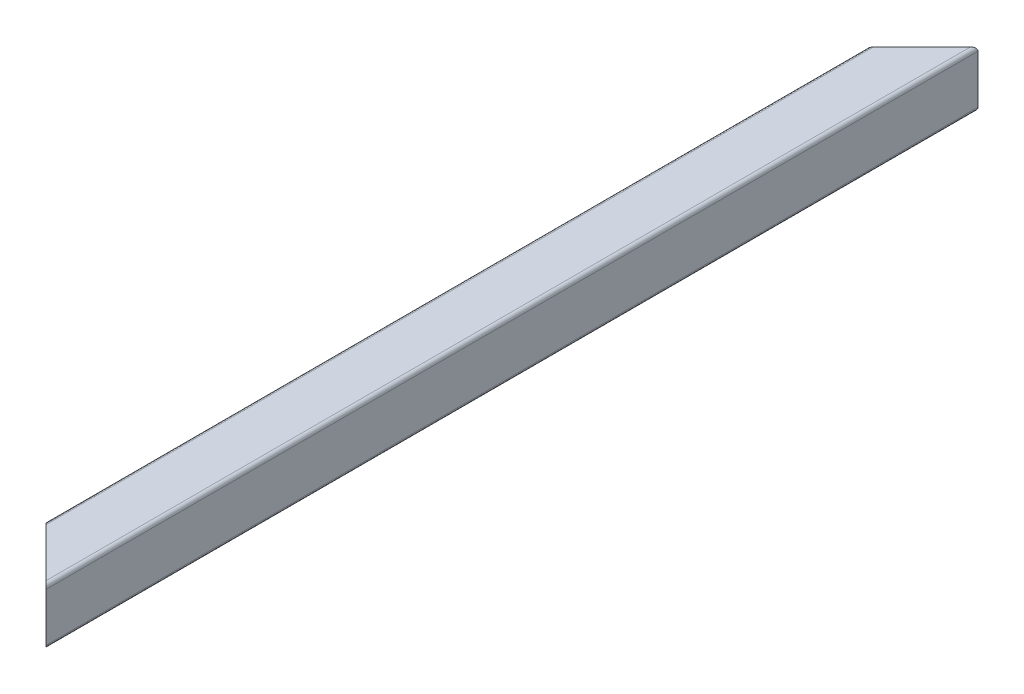
ISO-10303-21;
HEADER;
FILE_DESCRIPTION(('STEP AP214'),'2;1');
FILE_NAME('part.step','',(''),(''),'','','');
FILE_SCHEMA(('AUTOMOTIVE_DESIGN { 1 0 10303 214 1 1 1 1 }'));
ENDSEC;
DATA;
#1=APPLICATION_CONTEXT('core data for automotive mechanical design processes');
#2=APPLICATION_PROTOCOL_DEFINITION('international standard','automotive_design',2000,#1);
#3=PRODUCT_CONTEXT('',#1,'mechanical');
#4=PRODUCT('Part','Part','',(#3));
#5=PRODUCT_RELATED_PRODUCT_CATEGORY('part','',(#4));
#6=PRODUCT_DEFINITION_FORMATION('','',#4);
#7=PRODUCT_DEFINITION_CONTEXT('part definition',#1,'design');
#8=PRODUCT_DEFINITION('design','',#6,#7);
#9=PRODUCT_DEFINITION_SHAPE('','',#8);
#10=(LENGTH_UNIT() NAMED_UNIT(*) SI_UNIT(.MILLI.,.METRE.));
#11=(NAMED_UNIT(*) PLANE_ANGLE_UNIT() SI_UNIT($,.RADIAN.));
#12=(NAMED_UNIT(*) SI_UNIT($,.STERADIAN.) SOLID_ANGLE_UNIT());
#13=UNCERTAINTY_MEASURE_WITH_UNIT(LENGTH_MEASURE(1.E-05),#10,'distance_accuracy_value','');
#14=(GEOMETRIC_REPRESENTATION_CONTEXT(3) GLOBAL_UNCERTAINTY_ASSIGNED_CONTEXT((#13)) GLOBAL_UNIT_ASSIGNED_CONTEXT((#10,
#11,#12)) REPRESENTATION_CONTEXT('',''));
#15=CARTESIAN_POINT('',(0.,0.,0.));
#16=DIRECTION('',(0.,0.,1.));
#17=DIRECTION('',(1.,0.,0.));
#18=AXIS2_PLACEMENT_3D('',#15,#16,#17);
#19=CARTESIAN_POINT('',(15.,13.,-250.));
#20=DIRECTION('',(1.,0.,0.));
#21=DIRECTION('',(0.,1.,0.));
#22=AXIS2_PLACEMENT_3D('',#19,#20,#21);
#23=PLANE('',#22);
#24=DIRECTION('',(0.,0.,1.));
#25=VECTOR('',#24,1.);
#26=CARTESIAN_POINT('',(15.,13.,-250.));
#27=LINE('',#26,#25);
#28=CARTESIAN_POINT('',(15.,13.,-250.));
#29=VERTEX_POINT('',#28);
#30=CARTESIAN_POINT('',(15.,13.,250.));
#31=VERTEX_POINT('',#30);
#32=EDGE_CURVE('E157',#29,#31,#27,.T.);
#33=ORIENTED_EDGE('',*,*,#32,.T.);
#34=DIRECTION('',(0.,1.,0.));
#35=VECTOR('',#34,1.);
#36=CARTESIAN_POINT('',(15.,13.,250.));
#37=LINE('',#36,#35);
#38=CARTESIAN_POINT('',(15.,-13.,250.));
#39=VERTEX_POINT('',#38);
#40=EDGE_CURVE('E213',#39,#31,#37,.T.);
#41=ORIENTED_EDGE('',*,*,#40,.F.);
#42=DIRECTION('',(0.,0.,1.));
#43=VECTOR('',#42,1.);
#44=CARTESIAN_POINT('',(15.,-13.,-250.));
#45=LINE('',#44,#43);
#46=CARTESIAN_POINT('',(15.,-13.,-250.));
#47=VERTEX_POINT('',#46);
#48=EDGE_CURVE('E159',#47,#39,#45,.T.);
#49=ORIENTED_EDGE('',*,*,#48,.F.);
#50=DIRECTION('',(0.,1.,0.));
#51=VECTOR('',#50,1.);
#52=CARTESIAN_POINT('',(15.,13.,-250.));
#53=LINE('',#52,#51);
#54=EDGE_CURVE('E161',#47,#29,#53,.T.);
#55=ORIENTED_EDGE('',*,*,#54,.T.);
#56=EDGE_LOOP('',(#33,#41,#49,#55));
#57=FACE_BOUND('',#56,.T.);
#58=ADVANCED_FACE('F34',(#57),#23,.T.);
#59=CARTESIAN_POINT('',(13.,13.,-250.));
#60=DIRECTION('',(0.,0.,1.));
#61=DIRECTION('',(1.,0.,0.));
#62=AXIS2_PLACEMENT_3D('',#59,#60,#61);
#63=CYLINDRICAL_SURFACE('',#62,2.);
#64=ORIENTED_EDGE('',*,*,#32,.F.);
#65=CARTESIAN_POINT('',(13.,13.,-248.));
#66=DIRECTION('',(-0.707106781186544,0.,-0.707106781186551));
#67=DIRECTION('',(-0.707106781186551,0.,0.707106781186544));
#68=AXIS2_PLACEMENT_3D('',#65,#66,#67);
#69=ELLIPSE('',#68,2.82842712474618,2.);
#70=CARTESIAN_POINT('',(13.,15.,-248.));
#71=VERTEX_POINT('',#70);
#72=EDGE_CURVE('E202',#29,#71,#69,.F.);
#73=ORIENTED_EDGE('',*,*,#72,.T.);
#74=DIRECTION('',(0.,0.,1.));
#75=VECTOR('',#74,1.);
#76=CARTESIAN_POINT('',(13.,15.,-250.));
#77=LINE('',#76,#75);
#78=CARTESIAN_POINT('',(13.,15.,248.));
#79=VERTEX_POINT('',#78);
#80=EDGE_CURVE('E151',#71,#79,#77,.T.);
#81=ORIENTED_EDGE('',*,*,#80,.T.);
#82=CARTESIAN_POINT('',(13.,13.,248.));
#83=DIRECTION('',(-0.707106781186543,0.,0.707106781186552));
#84=DIRECTION('',(0.707106781186552,0.,0.707106781186543));
#85=AXIS2_PLACEMENT_3D('',#82,#83,#84);
#86=ELLIPSE('',#85,2.82842712474617,2.);
#87=EDGE_CURVE('E232',#79,#31,#86,.F.);
#88=ORIENTED_EDGE('',*,*,#87,.T.);
#89=EDGE_LOOP('',(#64,#73,#81,#88));
#90=FACE_BOUND('',#89,.T.);
#91=ADVANCED_FACE('F245',(#90),#63,.T.);
#92=CARTESIAN_POINT('',(-13.,15.,-250.));
#93=DIRECTION('',(0.,1.,0.));
#94=DIRECTION('',(0.,0.,1.));
#95=AXIS2_PLACEMENT_3D('',#92,#93,#94);
#96=PLANE('',#95);
#97=ORIENTED_EDGE('',*,*,#80,.F.);
#98=DIRECTION('',(-0.707106781186551,0.,0.707106781186544));
#99=VECTOR('',#98,1.);
#100=CARTESIAN_POINT('',(0.999999999999864,15.,-236.));
#101=LINE('',#100,#99);
#102=CARTESIAN_POINT('',(-13.,15.,-222.));
#103=VERTEX_POINT('',#102);
#104=EDGE_CURVE('E205',#71,#103,#101,.T.);
#105=ORIENTED_EDGE('',*,*,#104,.T.);
#106=DIRECTION('',(0.,0.,1.));
#107=VECTOR('',#106,1.);
#108=CARTESIAN_POINT('',(-13.,15.,-250.));
#109=LINE('',#108,#107);
#110=CARTESIAN_POINT('',(-13.,15.,222.));
#111=VERTEX_POINT('',#110);
#112=EDGE_CURVE('E147',#103,#111,#109,.T.);
#113=ORIENTED_EDGE('',*,*,#112,.T.);
#114=DIRECTION('',(0.707106781186552,0.,0.707106781186543));
#115=VECTOR('',#114,1.);
#116=CARTESIAN_POINT('',(-249.,15.,-13.9999999999969));
#117=LINE('',#116,#115);
#118=EDGE_CURVE('E127',#111,#79,#117,.T.);
#119=ORIENTED_EDGE('',*,*,#118,.T.);
#120=EDGE_LOOP('',(#97,#105,#113,#119));
#121=FACE_BOUND('',#120,.T.);
#122=ADVANCED_FACE('F242',(#121),#96,.T.);
#123=CARTESIAN_POINT('',(-13.,13.,-250.));
#124=DIRECTION('',(0.,0.,1.));
#125=DIRECTION('',(1.,0.,0.));
#126=AXIS2_PLACEMENT_3D('',#123,#124,#125);
#127=CYLINDRICAL_SURFACE('',#126,2.);
#128=ORIENTED_EDGE('',*,*,#112,.F.);
#129=CARTESIAN_POINT('',(-13.,13.,-222.));
#130=DIRECTION('',(-0.707106781186544,0.,-0.707106781186551));
#131=DIRECTION('',(-0.707106781186551,0.,0.707106781186544));
#132=AXIS2_PLACEMENT_3D('',#129,#130,#131);
#133=ELLIPSE('',#132,2.82842712474618,2.);
#134=CARTESIAN_POINT('',(-15.,13.,-220.));
#135=VERTEX_POINT('',#134);
#136=EDGE_CURVE('E146',#103,#135,#133,.F.);
#137=ORIENTED_EDGE('',*,*,#136,.T.);
#138=DIRECTION('',(0.,0.,1.));
#139=VECTOR('',#138,1.);
#140=CARTESIAN_POINT('',(-15.,13.,-250.));
#141=LINE('',#140,#139);
#142=CARTESIAN_POINT('',(-15.,13.,220.));
#143=VERTEX_POINT('',#142);
#144=EDGE_CURVE('E139',#135,#143,#141,.T.);
#145=ORIENTED_EDGE('',*,*,#144,.T.);
#146=CARTESIAN_POINT('',(-13.,13.,222.));
#147=DIRECTION('',(-0.707106781186543,0.,0.707106781186552));
#148=DIRECTION('',(0.707106781186552,0.,0.707106781186543));
#149=AXIS2_PLACEMENT_3D('',#146,#147,#148);
#150=ELLIPSE('',#149,2.82842712474617,2.);
#151=EDGE_CURVE('E121',#143,#111,#150,.F.);
#152=ORIENTED_EDGE('',*,*,#151,.T.);
#153=EDGE_LOOP('',(#128,#137,#145,#152));
#154=FACE_BOUND('',#153,.T.);
#155=ADVANCED_FACE('F145',(#154),#127,.T.);
#156=CARTESIAN_POINT('',(-15.,13.,-250.));
#157=DIRECTION('',(-1.,0.,0.));
#158=DIRECTION('',(0.,-1.,0.));
#159=AXIS2_PLACEMENT_3D('',#156,#157,#158);
#160=PLANE('',#159);
#161=ORIENTED_EDGE('',*,*,#144,.F.);
#162=DIRECTION('',(0.,-1.,0.));
#163=VECTOR('',#162,1.);
#164=CARTESIAN_POINT('',(-15.,250.,-220.));
#165=LINE('',#164,#163);
#166=CARTESIAN_POINT('',(-15.,-13.,-220.));
#167=VERTEX_POINT('',#166);
#168=EDGE_CURVE('E142',#135,#167,#165,.T.);
#169=ORIENTED_EDGE('',*,*,#168,.T.);
#170=DIRECTION('',(0.,0.,1.));
#171=VECTOR('',#170,1.);
#172=CARTESIAN_POINT('',(-15.,-13.,-250.));
#173=LINE('',#172,#171);
#174=CARTESIAN_POINT('',(-15.,-13.,220.));
#175=VERTEX_POINT('',#174);
#176=EDGE_CURVE('E141',#167,#175,#173,.T.);
#177=ORIENTED_EDGE('',*,*,#176,.T.);
#178=DIRECTION('',(0.,-1.,0.));
#179=VECTOR('',#178,1.);
#180=CARTESIAN_POINT('',(-15.,250.,220.));
#181=LINE('',#180,#179);
#182=EDGE_CURVE('E124',#143,#175,#181,.T.);
#183=ORIENTED_EDGE('',*,*,#182,.F.);
#184=EDGE_LOOP('',(#161,#169,#177,#183));
#185=FACE_BOUND('',#184,.T.);
#186=ADVANCED_FACE('F137',(#185),#160,.T.);
#187=CARTESIAN_POINT('',(-13.,-13.,-250.));
#188=DIRECTION('',(0.,0.,1.));
#189=DIRECTION('',(1.,0.,0.));
#190=AXIS2_PLACEMENT_3D('',#187,#188,#189);
#191=CYLINDRICAL_SURFACE('',#190,2.);
#192=ORIENTED_EDGE('',*,*,#176,.F.);
#193=CARTESIAN_POINT('',(-13.,-13.,-222.));
#194=DIRECTION('',(-0.707106781186544,0.,-0.707106781186551));
#195=DIRECTION('',(-0.707106781186551,0.,0.707106781186544));
#196=AXIS2_PLACEMENT_3D('',#193,#194,#195);
#197=ELLIPSE('',#196,2.82842712474618,2.);
#198=CARTESIAN_POINT('',(-13.,-15.,-222.));
#199=VERTEX_POINT('',#198);
#200=EDGE_CURVE('E184',#167,#199,#197,.F.);
#201=ORIENTED_EDGE('',*,*,#200,.T.);
#202=DIRECTION('',(0.,0.,1.));
#203=VECTOR('',#202,1.);
#204=CARTESIAN_POINT('',(-13.,-15.,-250.));
#205=LINE('',#204,#203);
#206=CARTESIAN_POINT('',(-13.,-15.,222.));
#207=VERTEX_POINT('',#206);
#208=EDGE_CURVE('E149',#199,#207,#205,.T.);
#209=ORIENTED_EDGE('',*,*,#208,.T.);
#210=CARTESIAN_POINT('',(-13.,-13.,222.));
#211=DIRECTION('',(-0.707106781186543,0.,0.707106781186552));
#212=DIRECTION('',(0.707106781186552,0.,0.707106781186543));
#213=AXIS2_PLACEMENT_3D('',#210,#211,#212);
#214=ELLIPSE('',#213,2.82842712474617,2.);
#215=EDGE_CURVE('E132',#207,#175,#214,.F.);
#216=ORIENTED_EDGE('',*,*,#215,.T.);
#217=EDGE_LOOP('',(#192,#201,#209,#216));
#218=FACE_BOUND('',#217,.T.);
#219=ADVANCED_FACE('F183',(#218),#191,.T.);
#220=CARTESIAN_POINT('',(-13.,-15.,-250.));
#221=DIRECTION('',(0.,-1.,0.));
#222=DIRECTION('',(0.,0.,-1.));
#223=AXIS2_PLACEMENT_3D('',#220,#221,#222);
#224=PLANE('',#223);
#225=ORIENTED_EDGE('',*,*,#208,.F.);
#226=DIRECTION('',(0.707106781186551,0.,-0.707106781186544));
#227=VECTOR('',#226,1.);
#228=CARTESIAN_POINT('',(0.999999999999866,-15.,-236.));
#229=LINE('',#228,#227);
#230=CARTESIAN_POINT('',(13.,-15.,-248.));
#231=VERTEX_POINT('',#230);
#232=EDGE_CURVE('E189',#199,#231,#229,.T.);
#233=ORIENTED_EDGE('',*,*,#232,.T.);
#234=DIRECTION('',(0.,0.,1.));
#235=VECTOR('',#234,1.);
#236=CARTESIAN_POINT('',(13.,-15.,-250.));
#237=LINE('',#236,#235);
#238=CARTESIAN_POINT('',(13.,-15.,248.));
#239=VERTEX_POINT('',#238);
#240=EDGE_CURVE('E42',#231,#239,#237,.T.);
#241=ORIENTED_EDGE('',*,*,#240,.T.);
#242=DIRECTION('',(-0.707106781186552,0.,-0.707106781186543));
#243=VECTOR('',#242,1.);
#244=CARTESIAN_POINT('',(-249.,-15.,-13.9999999999969));
#245=LINE('',#244,#243);
#246=EDGE_CURVE('E191',#239,#207,#245,.T.);
#247=ORIENTED_EDGE('',*,*,#246,.T.);
#248=EDGE_LOOP('',(#225,#233,#241,#247));
#249=FACE_BOUND('',#248,.T.);
#250=ADVANCED_FACE('F188',(#249),#224,.T.);
#251=CARTESIAN_POINT('',(13.,-13.,-250.));
#252=DIRECTION('',(0.,0.,1.));
#253=DIRECTION('',(1.,0.,0.));
#254=AXIS2_PLACEMENT_3D('',#251,#252,#253);
#255=CYLINDRICAL_SURFACE('',#254,2.);
#256=ORIENTED_EDGE('',*,*,#240,.F.);
#257=CARTESIAN_POINT('',(13.,-13.,-248.));
#258=DIRECTION('',(-0.707106781186544,0.,-0.707106781186551));
#259=DIRECTION('',(-0.707106781186551,0.,0.707106781186544));
#260=AXIS2_PLACEMENT_3D('',#257,#258,#259);
#261=ELLIPSE('',#260,2.82842712474618,2.);
#262=EDGE_CURVE('E211',#231,#47,#261,.F.);
#263=ORIENTED_EDGE('',*,*,#262,.T.);
#264=ORIENTED_EDGE('',*,*,#48,.T.);
#265=CARTESIAN_POINT('',(13.,-13.,248.));
#266=DIRECTION('',(-0.707106781186543,0.,0.707106781186552));
#267=DIRECTION('',(0.707106781186552,0.,0.707106781186543));
#268=AXIS2_PLACEMENT_3D('',#265,#266,#267);
#269=ELLIPSE('',#268,2.82842712474617,2.);
#270=EDGE_CURVE('E192',#39,#239,#269,.F.);
#271=ORIENTED_EDGE('',*,*,#270,.T.);
#272=EDGE_LOOP('',(#256,#263,#264,#271));
#273=FACE_BOUND('',#272,.T.);
#274=ADVANCED_FACE('F36',(#273),#255,.T.);
#275=CARTESIAN_POINT('',(15.,250.,250.));
#276=DIRECTION('',(-0.707106781186543,0.,0.707106781186552));
#277=DIRECTION('',(0.707106781186552,0.,0.707106781186543));
#278=AXIS2_PLACEMENT_3D('',#275,#276,#277);
#279=PLANE('',#278);
#280=ORIENTED_EDGE('',*,*,#40,.T.);
#281=ORIENTED_EDGE('',*,*,#87,.F.);
#282=ORIENTED_EDGE('',*,*,#118,.F.);
#283=ORIENTED_EDGE('',*,*,#151,.F.);
#284=ORIENTED_EDGE('',*,*,#182,.T.);
#285=ORIENTED_EDGE('',*,*,#215,.F.);
#286=ORIENTED_EDGE('',*,*,#246,.F.);
#287=ORIENTED_EDGE('',*,*,#270,.F.);
#288=EDGE_LOOP('',(#280,#281,#282,#283,#284,#285,#286,#287));
#289=FACE_BOUND('',#288,.T.);
#290=DIRECTION('',(0.,1.,0.));
#291=VECTOR('',#290,1.);
#292=CARTESIAN_POINT('',(-13.,13.0000000000001,222.));
#293=LINE('',#292,#291);
#294=CARTESIAN_POINT('',(-13.,-13.,222.));
#295=VERTEX_POINT('',#294);
#296=CARTESIAN_POINT('',(-13.,13.,222.));
#297=VERTEX_POINT('',#296);
#298=EDGE_CURVE('E230',#295,#297,#293,.T.);
#299=ORIENTED_EDGE('',*,*,#298,.T.);
#300=DIRECTION('',(0.707106781186552,0.,0.707106781186543));
#301=VECTOR('',#300,1.);
#302=CARTESIAN_POINT('',(-249.,13.,-13.9999999999969));
#303=LINE('',#302,#301);
#304=CARTESIAN_POINT('',(13.,13.,248.));
#305=VERTEX_POINT('',#304);
#306=EDGE_CURVE('E233',#297,#305,#303,.T.);
#307=ORIENTED_EDGE('',*,*,#306,.T.);
#308=DIRECTION('',(0.,-1.,0.));
#309=VECTOR('',#308,1.);
#310=CARTESIAN_POINT('',(13.,13.,248.));
#311=LINE('',#310,#309);
#312=CARTESIAN_POINT('',(13.,-13.,248.));
#313=VERTEX_POINT('',#312);
#314=EDGE_CURVE('E49',#305,#313,#311,.T.);
#315=ORIENTED_EDGE('',*,*,#314,.T.);
#316=DIRECTION('',(-0.707106781186552,0.,-0.707106781186543));
#317=VECTOR('',#316,1.);
#318=CARTESIAN_POINT('',(-249.,-13.,-13.9999999999969));
#319=LINE('',#318,#317);
#320=EDGE_CURVE('E225',#313,#295,#319,.T.);
#321=ORIENTED_EDGE('',*,*,#320,.T.);
#322=EDGE_LOOP('',(#299,#307,#315,#321));
#323=FACE_BOUND('',#322,.T.);
#324=ADVANCED_FACE('F123',(#289,#323),#279,.T.);
#325=CARTESIAN_POINT('',(-13.,13.,-250.));
#326=DIRECTION('',(-1.,0.,0.));
#327=DIRECTION('',(0.,-1.,0.));
#328=AXIS2_PLACEMENT_3D('',#325,#326,#327);
#329=PLANE('',#328);
#330=DIRECTION('',(0.,-1.,0.));
#331=VECTOR('',#330,1.);
#332=CARTESIAN_POINT('',(-13.,13.,-222.));
#333=LINE('',#332,#331);
#334=CARTESIAN_POINT('',(-13.,13.,-222.));
#335=VERTEX_POINT('',#334);
#336=CARTESIAN_POINT('',(-13.,-13.,-222.));
#337=VERTEX_POINT('',#336);
#338=EDGE_CURVE('E56',#335,#337,#333,.T.);
#339=ORIENTED_EDGE('',*,*,#338,.F.);
#340=DIRECTION('',(0.,0.,1.));
#341=VECTOR('',#340,1.);
#342=CARTESIAN_POINT('',(-13.,13.,-250.));
#343=LINE('',#342,#341);
#344=EDGE_CURVE('E168',#335,#297,#343,.T.);
#345=ORIENTED_EDGE('',*,*,#344,.T.);
#346=ORIENTED_EDGE('',*,*,#298,.F.);
#347=DIRECTION('',(0.,0.,1.));
#348=VECTOR('',#347,1.);
#349=CARTESIAN_POINT('',(-13.,-13.,-250.));
#350=LINE('',#349,#348);
#351=EDGE_CURVE('E176',#337,#295,#350,.T.);
#352=ORIENTED_EDGE('',*,*,#351,.F.);
#353=EDGE_LOOP('',(#339,#345,#346,#352));
#354=FACE_BOUND('',#353,.T.);
#355=ADVANCED_FACE('F228',(#354),#329,.F.);
#356=CARTESIAN_POINT('',(-13.,13.,-250.));
#357=DIRECTION('',(0.,1.,0.));
#358=DIRECTION('',(0.,0.,1.));
#359=AXIS2_PLACEMENT_3D('',#356,#357,#358);
#360=PLANE('',#359);
#361=DIRECTION('',(-0.707106781186551,0.,0.707106781186544));
#362=VECTOR('',#361,1.);
#363=CARTESIAN_POINT('',(0.999999999999859,13.,-236.));
#364=LINE('',#363,#362);
#365=CARTESIAN_POINT('',(13.,13.,-248.));
#366=VERTEX_POINT('',#365);
#367=EDGE_CURVE('E199',#366,#335,#364,.T.);
#368=ORIENTED_EDGE('',*,*,#367,.F.);
#369=DIRECTION('',(0.,0.,1.));
#370=VECTOR('',#369,1.);
#371=CARTESIAN_POINT('',(13.,13.,-250.));
#372=LINE('',#371,#370);
#373=EDGE_CURVE('E172',#366,#305,#372,.T.);
#374=ORIENTED_EDGE('',*,*,#373,.T.);
#375=ORIENTED_EDGE('',*,*,#306,.F.);
#376=ORIENTED_EDGE('',*,*,#344,.F.);
#377=EDGE_LOOP('',(#368,#374,#375,#376));
#378=FACE_BOUND('',#377,.T.);
#379=ADVANCED_FACE('F256',(#378),#360,.F.);
#380=CARTESIAN_POINT('',(13.,13.,-250.));
#381=DIRECTION('',(1.,0.,0.));
#382=DIRECTION('',(0.,1.,0.));
#383=AXIS2_PLACEMENT_3D('',#380,#381,#382);
#384=PLANE('',#383);
#385=DIRECTION('',(0.,1.,0.));
#386=VECTOR('',#385,1.);
#387=CARTESIAN_POINT('',(13.,13.,-248.));
#388=LINE('',#387,#386);
#389=CARTESIAN_POINT('',(13.,-13.,-248.));
#390=VERTEX_POINT('',#389);
#391=EDGE_CURVE('E194',#390,#366,#388,.T.);
#392=ORIENTED_EDGE('',*,*,#391,.F.);
#393=DIRECTION('',(0.,0.,1.));
#394=VECTOR('',#393,1.);
#395=CARTESIAN_POINT('',(13.,-13.,-250.));
#396=LINE('',#395,#394);
#397=EDGE_CURVE('E216',#390,#313,#396,.T.);
#398=ORIENTED_EDGE('',*,*,#397,.T.);
#399=ORIENTED_EDGE('',*,*,#314,.F.);
#400=ORIENTED_EDGE('',*,*,#373,.F.);
#401=EDGE_LOOP('',(#392,#398,#399,#400));
#402=FACE_BOUND('',#401,.T.);
#403=ADVANCED_FACE('F278',(#402),#384,.F.);
#404=CARTESIAN_POINT('',(-13.,-13.,-250.));
#405=DIRECTION('',(0.,-1.,0.));
#406=DIRECTION('',(1.,0.,0.));
#407=AXIS2_PLACEMENT_3D('',#404,#405,#406);
#408=PLANE('',#407);
#409=DIRECTION('',(0.707106781186551,0.,-0.707106781186544));
#410=VECTOR('',#409,1.);
#411=CARTESIAN_POINT('',(0.999999999999857,-13.,-236.));
#412=LINE('',#411,#410);
#413=EDGE_CURVE('E11',#337,#390,#412,.T.);
#414=ORIENTED_EDGE('',*,*,#413,.F.);
#415=ORIENTED_EDGE('',*,*,#351,.T.);
#416=ORIENTED_EDGE('',*,*,#320,.F.);
#417=ORIENTED_EDGE('',*,*,#397,.F.);
#418=EDGE_LOOP('',(#414,#415,#416,#417));
#419=FACE_BOUND('',#418,.T.);
#420=ADVANCED_FACE('F224',(#419),#408,.F.);
#421=CARTESIAN_POINT('',(15.,250.,-250.));
#422=DIRECTION('',(-0.707106781186544,0.,-0.707106781186551));
#423=DIRECTION('',(-0.707106781186551,0.,0.707106781186544));
#424=AXIS2_PLACEMENT_3D('',#421,#422,#423);
#425=PLANE('',#424);
#426=ORIENTED_EDGE('',*,*,#232,.F.);
#427=ORIENTED_EDGE('',*,*,#200,.F.);
#428=ORIENTED_EDGE('',*,*,#168,.F.);
#429=ORIENTED_EDGE('',*,*,#136,.F.);
#430=ORIENTED_EDGE('',*,*,#104,.F.);
#431=ORIENTED_EDGE('',*,*,#72,.F.);
#432=ORIENTED_EDGE('',*,*,#54,.F.);
#433=ORIENTED_EDGE('',*,*,#262,.F.);
#434=EDGE_LOOP('',(#426,#427,#428,#429,#430,#431,#432,#433));
#435=FACE_BOUND('',#434,.T.);
#436=ORIENTED_EDGE('',*,*,#338,.T.);
#437=ORIENTED_EDGE('',*,*,#413,.T.);
#438=ORIENTED_EDGE('',*,*,#391,.T.);
#439=ORIENTED_EDGE('',*,*,#367,.T.);
#440=EDGE_LOOP('',(#436,#437,#438,#439));
#441=FACE_BOUND('',#440,.T.);
#442=ADVANCED_FACE('F247',(#435,#441),#425,.T.);
#443=CLOSED_SHELL('',(#58,#91,#122,#155,#186,#219,#250,#274,#324,#355,#379,#403,#420,#442));
#444=MANIFOLD_SOLID_BREP('B2',#443);
#445=ADVANCED_BREP_SHAPE_REPRESENTATION('',(#18,#444),#14);
#446=SHAPE_DEFINITION_REPRESENTATION(#9,#445);
ENDSEC;
END-ISO-10303-21;
